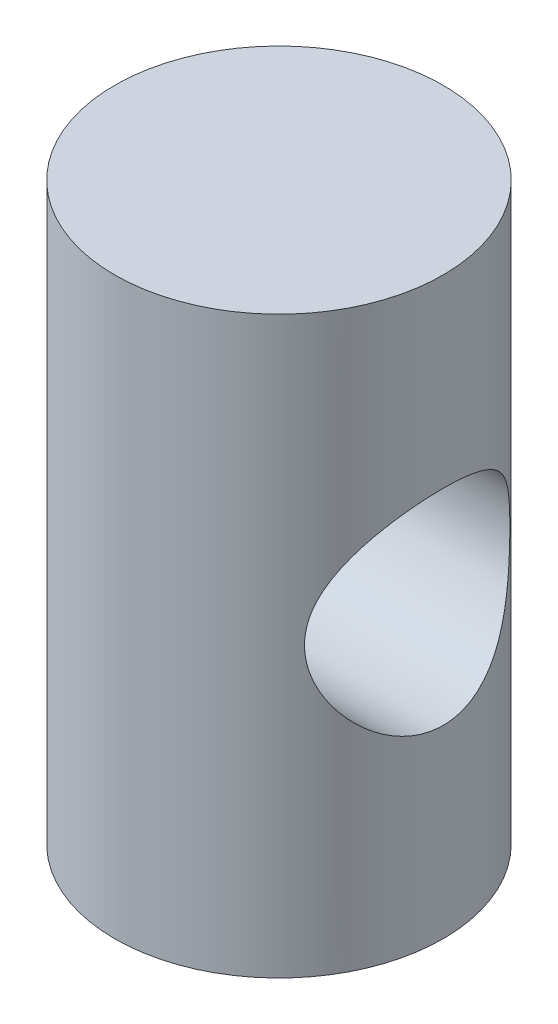
ISO-10303-21;
HEADER;
FILE_DESCRIPTION(('STEP AP214'),'2;1');
FILE_NAME('part.step','',(''),(''),'','','');
FILE_SCHEMA(('AUTOMOTIVE_DESIGN { 1 0 10303 214 1 1 1 1 }'));
ENDSEC;
DATA;
#1=APPLICATION_CONTEXT('core data for automotive mechanical design processes');
#2=APPLICATION_PROTOCOL_DEFINITION('international standard','automotive_design',2000,#1);
#3=PRODUCT_CONTEXT('',#1,'mechanical');
#4=PRODUCT('Part','Part','',(#3));
#5=PRODUCT_RELATED_PRODUCT_CATEGORY('part','',(#4));
#6=PRODUCT_DEFINITION_FORMATION('','',#4);
#7=PRODUCT_DEFINITION_CONTEXT('part definition',#1,'design');
#8=PRODUCT_DEFINITION('design','',#6,#7);
#9=PRODUCT_DEFINITION_SHAPE('','',#8);
#10=(LENGTH_UNIT() NAMED_UNIT(*) SI_UNIT(.MILLI.,.METRE.));
#11=(NAMED_UNIT(*) PLANE_ANGLE_UNIT() SI_UNIT($,.RADIAN.));
#12=(NAMED_UNIT(*) SI_UNIT($,.STERADIAN.) SOLID_ANGLE_UNIT());
#13=UNCERTAINTY_MEASURE_WITH_UNIT(LENGTH_MEASURE(1.E-05),#10,'distance_accuracy_value','');
#14=(GEOMETRIC_REPRESENTATION_CONTEXT(3) GLOBAL_UNCERTAINTY_ASSIGNED_CONTEXT((#13)) GLOBAL_UNIT_ASSIGNED_CONTEXT((#10,
#11,#12)) REPRESENTATION_CONTEXT('',''));
#15=CARTESIAN_POINT('',(0.,0.,0.));
#16=DIRECTION('',(0.,0.,1.));
#17=DIRECTION('',(1.,0.,0.));
#18=AXIS2_PLACEMENT_3D('',#15,#16,#17);
#19=CARTESIAN_POINT('',(0.,7.,0.));
#20=DIRECTION('',(0.,-1.,0.));
#21=DIRECTION('',(0.,0.,-1.));
#22=AXIS2_PLACEMENT_3D('',#19,#20,#21);
#23=CYLINDRICAL_SURFACE('',#22,4.);
#24=CARTESIAN_POINT('',(-3.1224989991992,0.,-2.5));
#25=CARTESIAN_POINT('',(-3.12249991555421,0.0621567514455108,-2.49999941097139));
#26=CARTESIAN_POINT('',(-3.12436490733917,0.124325946670792,-2.49767581942173));
#27=CARTESIAN_POINT('',(-3.13172923119026,0.248117179547742,-2.48843349840857));
#28=CARTESIAN_POINT('',(-3.13723070381364,0.309738873257102,-2.48151206248433));
#29=CARTESIAN_POINT('',(-3.15888953558505,0.493226047743712,-2.45397595058365));
#30=CARTESIAN_POINT('',(-3.18020036271142,0.613548331188979,-2.42658990946459));
#31=CARTESIAN_POINT('',(-3.23299770760367,0.845598197878236,-2.35576217141198));
#32=CARTESIAN_POINT('',(-3.26439575383209,0.957390415055104,-2.31245961359202));
#33=CARTESIAN_POINT('',(-3.3336600088444,1.17200852533406,-2.21143916430899));
#34=CARTESIAN_POINT('',(-3.37152639405534,1.27483417375309,-2.15372087963017));
#35=CARTESIAN_POINT('',(-3.45559225121876,1.48373398130366,-2.01647682425577));
#36=CARTESIAN_POINT('',(-3.50222814511578,1.58839332500452,-1.93506425666949));
#37=CARTESIAN_POINT('',(-3.59505503533368,1.7837615516238,-1.75662526657432));
#38=CARTESIAN_POINT('',(-3.64124561158438,1.87445827995362,-1.65958538899782));
#39=CARTESIAN_POINT('',(-3.73459524771314,2.05022029817268,-1.43833990582854));
#40=CARTESIAN_POINT('',(-3.78119887781505,2.13328618445043,-1.31226934259651));
#41=CARTESIAN_POINT('',(-3.84307251838774,2.24054515473624,-1.11163395543429));
#42=CARTESIAN_POINT('',(-3.86236283092052,2.27341513833311,-1.04281240974104));
#43=CARTESIAN_POINT('',(-3.89770436975436,2.33295468536328,-0.901758767615548));
#44=CARTESIAN_POINT('',(-3.91375783207118,2.35962853103842,-0.829529068393796));
#45=CARTESIAN_POINT('',(-3.94066759113823,2.40398381525628,-0.689700297916575));
#46=CARTESIAN_POINT('',(-3.95188535984466,2.42230197651811,-0.622371981278588));
#47=CARTESIAN_POINT('',(-3.97096241909162,2.45330228631336,-0.485997575898807));
#48=CARTESIAN_POINT('',(-3.97882364879721,2.46598768921621,-0.416952503441682));
#49=CARTESIAN_POINT('',(-3.99095470334737,2.48551379763454,-0.277765449857173));
#50=CARTESIAN_POINT('',(-3.99522674847834,2.49235811651341,-0.207624174243905));
#51=CARTESIAN_POINT('',(-4.00006125072438,2.50009921338922,-0.0669114466599384));
#52=CARTESIAN_POINT('',(-4.00062413482248,2.50099667596335,0.0036599548602794));
#53=CARTESIAN_POINT('',(-3.99704479619503,2.49527462645275,0.196045081555539));
#54=CARTESIAN_POINT('',(-3.98917040897436,2.48269349692112,0.317681845488536));
#55=CARTESIAN_POINT('',(-3.96290903275931,2.44026978203388,0.556636494620256));
#56=CARTESIAN_POINT('',(-3.94452124920477,2.41042589202638,0.673954052677426));
#57=CARTESIAN_POINT('',(-3.89876170711609,2.33479144071674,0.901771991763867));
#58=CARTESIAN_POINT('',(-3.87136697381047,2.28896008042893,1.01225407159606));
#59=CARTESIAN_POINT('',(-3.80971291751354,2.18306276101571,1.22404012071223));
#60=CARTESIAN_POINT('',(-3.77545203089318,2.12299355893635,1.32534199174245));
#61=CARTESIAN_POINT('',(-3.69786441247167,1.98194358307633,1.52942649744659));
#62=CARTESIAN_POINT('',(-3.65394006381521,1.89929072330952,1.63082454612907));
#63=CARTESIAN_POINT('',(-3.56390927740507,1.71973526279293,1.81919733573063));
#64=CARTESIAN_POINT('',(-3.51779973570409,1.62281195361603,1.90615071842624));
#65=CARTESIAN_POINT('',(-3.42142883464466,1.40258874682652,2.07470887167909));
#66=CARTESIAN_POINT('',(-3.37141162686597,1.27749723664192,2.15413229677844));
#67=CARTESIAN_POINT('',(-3.28028278192382,1.01270776269859,2.29052307550563));
#68=CARTESIAN_POINT('',(-3.23915480386931,0.873037312546894,2.34753179448504));
#69=CARTESIAN_POINT('',(-3.18183753131763,0.620461193893754,2.42437133527931));
#70=CARTESIAN_POINT('',(-3.16193408602513,0.510178074786512,2.45003683445404));
#71=CARTESIAN_POINT('',(-3.13358277759547,0.285769622440112,2.48620337073091));
#72=CARTESIAN_POINT('',(-3.12511926504439,0.171649757343194,2.49672512520811));
#73=CARTESIAN_POINT('',(-3.12092267030677,-0.0574573605024475,2.5019707209518));
#74=CARTESIAN_POINT('',(-3.12521876170185,-0.172446000478454,2.49665835896695));
#75=CARTESIAN_POINT('',(-3.14592085836188,-0.399561164318478,2.47051466367814));
#76=CARTESIAN_POINT('',(-3.16233689222906,-0.511685238371181,2.44967047849126));
#77=CARTESIAN_POINT('',(-3.20460120797143,-0.728436759425692,2.39409874195038));
#78=CARTESIAN_POINT('',(-3.23028954367817,-0.833157315894326,2.35960571424757));
#79=CARTESIAN_POINT('',(-3.28831148388749,-1.03557469989379,2.27804893702243));
#80=CARTESIAN_POINT('',(-3.32064744602081,-1.13326901887797,2.23098072583746));
#81=CARTESIAN_POINT('',(-3.39574401285203,-1.33861194166319,2.11530798730694));
#82=CARTESIAN_POINT('',(-3.43931724293015,-1.44461452730177,2.04430931160544));
#83=CARTESIAN_POINT('',(-3.52787943213338,-1.64437066065426,1.88737868921489));
#84=CARTESIAN_POINT('',(-3.57286982004467,-1.73811132124234,1.80143124902619));
#85=CARTESIAN_POINT('',(-3.66766209459505,-1.92596407064096,1.6007693249212));
#86=CARTESIAN_POINT('',(-3.71707933883201,-2.01772739848491,1.48365201617176));
#87=CARTESIAN_POINT('',(-3.80768973398606,-2.18014701471972,1.23256787407809));
#88=CARTESIAN_POINT('',(-3.84888673619009,-2.25081319512692,1.09860897940973));
#89=CARTESIAN_POINT('',(-3.89988966499776,-2.33658106797499,0.891930804655077));
#90=CARTESIAN_POINT('',(-3.91477055097245,-2.36129744395128,0.824318196039416));
#91=CARTESIAN_POINT('',(-3.94124643918619,-2.40493827673228,0.686640792876419));
#92=CARTESIAN_POINT('',(-3.95284334314805,-2.42386608615092,0.616577444051131));
#93=CARTESIAN_POINT('',(-3.9723851203995,-2.45560583013925,0.47463923146426));
#94=CARTESIAN_POINT('',(-3.98033317908836,-2.46842309951643,0.402766005755503));
#95=CARTESIAN_POINT('',(-3.99234168343343,-2.48773917229289,0.257881807142457));
#96=CARTESIAN_POINT('',(-3.99640277220024,-2.49423902093079,0.184871024482531));
#97=CARTESIAN_POINT('',(-4.00191521492706,-2.50307151550711,-0.0131102774248963));
#98=CARTESIAN_POINT('',(-3.99952706123947,-2.49926579290941,-0.138539079205454));
#99=CARTESIAN_POINT('',(-3.98321975018363,-2.47308241045447,-0.386583137102135));
#100=CARTESIAN_POINT('',(-3.96930111604857,-2.45070559332119,-0.509198520626834));
#101=CARTESIAN_POINT('',(-3.93192083384285,-2.38967758445389,-0.744080605483852));
#102=CARTESIAN_POINT('',(-3.90880701054803,-2.35161792643533,-0.856558752631814));
#103=CARTESIAN_POINT('',(-3.85489971248843,-2.26088053755652,-1.07343034721918));
#104=CARTESIAN_POINT('',(-3.82410494215309,-2.2082003404328,-1.17782242685803));
#105=CARTESIAN_POINT('',(-3.75350673935648,-2.08367872128004,-1.38731297754797));
#106=CARTESIAN_POINT('',(-3.71310001864657,-2.0104160092425,-1.4913601218378));
#107=CARTESIAN_POINT('',(-3.62867283985206,-1.84984676748589,-1.68643334934803));
#108=CARTESIAN_POINT('',(-3.58464833191203,-1.76252439116572,-1.77744451843681));
#109=CARTESIAN_POINT('',(-3.49000828219719,-1.56176748493813,-1.95744716561589));
#110=CARTESIAN_POINT('',(-3.43935738427104,-1.44638338742857,-2.04425661250064));
#111=CARTESIAN_POINT('',(-3.34349647457112,-1.20071059024024,-2.19754648509904));
#112=CARTESIAN_POINT('',(-3.2982834620419,-1.07043018884747,-2.26403815415028));
#113=CARTESIAN_POINT('',(-3.22859539780091,-0.827194699215084,-2.3619822941284));
#114=CARTESIAN_POINT('',(-3.20174639338769,-0.716729427846442,-2.39792458576829));
#115=CARTESIAN_POINT('',(-3.1587835810451,-0.490060656998224,-2.45425618419746));
#116=CARTESIAN_POINT('',(-3.14263581150428,-0.373876580200281,-2.47469472410168));
#117=CARTESIAN_POINT('',(-3.12952857640607,-0.213940005353927,-2.49119847139522));
#118=CARTESIAN_POINT('',(-3.1268999430677,-0.171274474291342,-2.49449433837959));
#119=CARTESIAN_POINT('',(-3.12338461939862,-0.0857413010482517,-2.49889558125807));
#120=CARTESIAN_POINT('',(-3.12249836712871,-0.0428736107566455,-2.50000040629188));
#121=CARTESIAN_POINT('',(-3.1224989991992,0.,-2.5));
#122=B_SPLINE_CURVE_WITH_KNOTS('',3,(#24,#25,#26,#27,#28,#29,#30,#31,#32,#33,#34,#35,#36,#37,
#38,#39,#40,#41,#42,#43,#44,#45,#46,#47,#48,#49,#50,#51,#52,#53,#54,#55,#56,#57,#58,#59,#60,#61,
#62,#63,#64,#65,#66,#67,#68,#69,#70,#71,#72,#73,#74,#75,#76,#77,#78,#79,#80,#81,#82,#83,#84,#85,
#86,#87,#88,#89,#90,#91,#92,#93,#94,#95,#96,#97,#98,#99,#100,#101,#102,#103,#104,#105,#106,#107,
#108,#109,#110,#111,#112,#113,#114,#115,#116,#117,#118,#119,#120,#121),.UNSPECIFIED.,.T.,.F.,(4,
2,2,2,2,2,2,2,2,2,2,2,2,2,2,2,2,2,2,2,2,2,2,2,2,2,2,2,2,2,2,2,2,2,2,2,2,2,2,2,2,2,2,2,2,2,2,2,
4),(0.,0.18641531585846,0.372940459994496,0.746478880764687,1.11682668423133,1.48718459072605,
1.90722798685071,2.32763499192879,2.7987602926597,3.03445880867314,3.26999394209509,
3.48170145743206,3.69328649746504,3.90474055342595,4.11617026725867,4.48184709708114,
4.84755156693919,5.21419620193004,5.58092442797435,5.99329080205307,6.40626158573465,
6.87316206383505,7.33919680735486,7.68265621505466,8.02564530559509,8.36941921026407,
8.7134778886509,9.05186495232126,9.390372235192,9.79332737765188,10.1967026751544,
10.6647326786671,11.1325428866818,11.3527929661039,11.5729152387447,11.7928449800804,
12.0127383271002,12.3871595324234,12.7615637480926,13.1229788842094,13.4844550226785,
13.8834503840958,14.2828986410983,14.7399238503459,15.1966956936287,15.5530255473292,
15.9082190611886,16.0367696833384,16.1653526209168),.UNSPECIFIED.);
#123=CARTESIAN_POINT('',(-3.1224989991992,0.,-2.5));
#124=VERTEX_POINT('',#123);
#125=EDGE_CURVE('E47',#124,#124,#122,.T.);
#126=ORIENTED_EDGE('',*,*,#125,.T.);
#127=EDGE_LOOP('',(#126));
#128=FACE_BOUND('',#127,.T.);
#129=CARTESIAN_POINT('',(3.1224989991992,0.,-2.5));
#130=CARTESIAN_POINT('',(3.12249991555421,-0.0621567514455108,-2.49999941097139));
#131=CARTESIAN_POINT('',(3.12436490733917,-0.124325946670792,-2.49767581942173));
#132=CARTESIAN_POINT('',(3.13172923119026,-0.248117179547742,-2.48843349840857));
#133=CARTESIAN_POINT('',(3.13723070381364,-0.309738873257102,-2.48151206248433));
#134=CARTESIAN_POINT('',(3.15888953558505,-0.493226047743712,-2.45397595058365));
#135=CARTESIAN_POINT('',(3.18020036271142,-0.613548331188979,-2.42658990946459));
#136=CARTESIAN_POINT('',(3.23299770760367,-0.845598197878236,-2.35576217141198));
#137=CARTESIAN_POINT('',(3.26439575383209,-0.957390415055104,-2.31245961359202));
#138=CARTESIAN_POINT('',(3.3336600088444,-1.17200852533406,-2.21143916430899));
#139=CARTESIAN_POINT('',(3.37152639405534,-1.27483417375309,-2.15372087963017));
#140=CARTESIAN_POINT('',(3.45559225121876,-1.48373398130366,-2.01647682425577));
#141=CARTESIAN_POINT('',(3.50222814511578,-1.58839332500452,-1.93506425666949));
#142=CARTESIAN_POINT('',(3.59505503533368,-1.7837615516238,-1.75662526657432));
#143=CARTESIAN_POINT('',(3.64124561158438,-1.87445827995362,-1.65958538899782));
#144=CARTESIAN_POINT('',(3.73459524771314,-2.05022029817268,-1.43833990582854));
#145=CARTESIAN_POINT('',(3.78119887781505,-2.13328618445043,-1.31226934259651));
#146=CARTESIAN_POINT('',(3.84307251838774,-2.24054515473624,-1.11163395543429));
#147=CARTESIAN_POINT('',(3.86236283092052,-2.27341513833311,-1.04281240974104));
#148=CARTESIAN_POINT('',(3.89770436975436,-2.33295468536328,-0.901758767615548));
#149=CARTESIAN_POINT('',(3.91375783207118,-2.35962853103842,-0.829529068393796));
#150=CARTESIAN_POINT('',(3.94066759113823,-2.40398381525628,-0.689700297916575));
#151=CARTESIAN_POINT('',(3.95188535984466,-2.42230197651811,-0.622371981278588));
#152=CARTESIAN_POINT('',(3.97096241909162,-2.45330228631336,-0.485997575898807));
#153=CARTESIAN_POINT('',(3.97882364879721,-2.46598768921621,-0.416952503441682));
#154=CARTESIAN_POINT('',(3.99095470334737,-2.48551379763454,-0.277765449857173));
#155=CARTESIAN_POINT('',(3.99522674847834,-2.49235811651341,-0.207624174243905));
#156=CARTESIAN_POINT('',(4.00006125072438,-2.50009921338922,-0.0669114466599384));
#157=CARTESIAN_POINT('',(4.00062413482248,-2.50099667596335,0.0036599548602794));
#158=CARTESIAN_POINT('',(3.99704479619503,-2.49527462645275,0.196045081555539));
#159=CARTESIAN_POINT('',(3.98917040897436,-2.48269349692112,0.317681845488536));
#160=CARTESIAN_POINT('',(3.96290903275931,-2.44026978203388,0.556636494620256));
#161=CARTESIAN_POINT('',(3.94452124920477,-2.41042589202638,0.673954052677426));
#162=CARTESIAN_POINT('',(3.89876170711609,-2.33479144071674,0.901771991763867));
#163=CARTESIAN_POINT('',(3.87136697381047,-2.28896008042893,1.01225407159606));
#164=CARTESIAN_POINT('',(3.80971291751354,-2.18306276101571,1.22404012071223));
#165=CARTESIAN_POINT('',(3.77545203089318,-2.12299355893635,1.32534199174245));
#166=CARTESIAN_POINT('',(3.69786441247167,-1.98194358307633,1.52942649744659));
#167=CARTESIAN_POINT('',(3.65394006381521,-1.89929072330952,1.63082454612907));
#168=CARTESIAN_POINT('',(3.56390927740507,-1.71973526279293,1.81919733573063));
#169=CARTESIAN_POINT('',(3.51779973570409,-1.62281195361603,1.90615071842624));
#170=CARTESIAN_POINT('',(3.42142883464466,-1.40258874682652,2.07470887167909));
#171=CARTESIAN_POINT('',(3.37141162686597,-1.27749723664192,2.15413229677844));
#172=CARTESIAN_POINT('',(3.28028278192382,-1.01270776269859,2.29052307550563));
#173=CARTESIAN_POINT('',(3.23915480386931,-0.873037312546894,2.34753179448504));
#174=CARTESIAN_POINT('',(3.18183753131763,-0.620461193893754,2.42437133527931));
#175=CARTESIAN_POINT('',(3.16193408602513,-0.510178074786512,2.45003683445404));
#176=CARTESIAN_POINT('',(3.13358277759547,-0.285769622440112,2.48620337073091));
#177=CARTESIAN_POINT('',(3.12511926504439,-0.171649757343194,2.49672512520811));
#178=CARTESIAN_POINT('',(3.12092267030677,0.0574573605024475,2.5019707209518));
#179=CARTESIAN_POINT('',(3.12521876170185,0.172446000478454,2.49665835896695));
#180=CARTESIAN_POINT('',(3.14592085836188,0.399561164318478,2.47051466367814));
#181=CARTESIAN_POINT('',(3.16233689222906,0.511685238371181,2.44967047849126));
#182=CARTESIAN_POINT('',(3.20460120797143,0.728436759425692,2.39409874195038));
#183=CARTESIAN_POINT('',(3.23028954367817,0.833157315894326,2.35960571424757));
#184=CARTESIAN_POINT('',(3.28831148388749,1.03557469989379,2.27804893702243));
#185=CARTESIAN_POINT('',(3.32064744602081,1.13326901887797,2.23098072583746));
#186=CARTESIAN_POINT('',(3.39574401285203,1.33861194166319,2.11530798730694));
#187=CARTESIAN_POINT('',(3.43931724293015,1.44461452730177,2.04430931160544));
#188=CARTESIAN_POINT('',(3.52787943213338,1.64437066065426,1.88737868921489));
#189=CARTESIAN_POINT('',(3.57286982004467,1.73811132124234,1.80143124902619));
#190=CARTESIAN_POINT('',(3.66766209459505,1.92596407064096,1.6007693249212));
#191=CARTESIAN_POINT('',(3.71707933883201,2.01772739848491,1.48365201617176));
#192=CARTESIAN_POINT('',(3.80768973398606,2.18014701471972,1.23256787407809));
#193=CARTESIAN_POINT('',(3.84888673619009,2.25081319512692,1.09860897940973));
#194=CARTESIAN_POINT('',(3.89988966499776,2.33658106797499,0.891930804655077));
#195=CARTESIAN_POINT('',(3.91477055097245,2.36129744395128,0.824318196039416));
#196=CARTESIAN_POINT('',(3.94124643918619,2.40493827673228,0.686640792876419));
#197=CARTESIAN_POINT('',(3.95284334314805,2.42386608615092,0.616577444051131));
#198=CARTESIAN_POINT('',(3.9723851203995,2.45560583013925,0.47463923146426));
#199=CARTESIAN_POINT('',(3.98033317908836,2.46842309951643,0.402766005755503));
#200=CARTESIAN_POINT('',(3.99234168343343,2.48773917229289,0.257881807142457));
#201=CARTESIAN_POINT('',(3.99640277220024,2.49423902093079,0.184871024482531));
#202=CARTESIAN_POINT('',(4.00191521492706,2.50307151550711,-0.0131102774248963));
#203=CARTESIAN_POINT('',(3.99952706123947,2.49926579290941,-0.138539079205454));
#204=CARTESIAN_POINT('',(3.98321975018363,2.47308241045447,-0.386583137102135));
#205=CARTESIAN_POINT('',(3.96930111604857,2.45070559332119,-0.509198520626834));
#206=CARTESIAN_POINT('',(3.93192083384285,2.38967758445389,-0.744080605483852));
#207=CARTESIAN_POINT('',(3.90880701054803,2.35161792643533,-0.856558752631814));
#208=CARTESIAN_POINT('',(3.85489971248843,2.26088053755652,-1.07343034721918));
#209=CARTESIAN_POINT('',(3.82410494215309,2.2082003404328,-1.17782242685803));
#210=CARTESIAN_POINT('',(3.75350673935648,2.08367872128004,-1.38731297754797));
#211=CARTESIAN_POINT('',(3.71310001864657,2.0104160092425,-1.4913601218378));
#212=CARTESIAN_POINT('',(3.62867283985206,1.84984676748589,-1.68643334934803));
#213=CARTESIAN_POINT('',(3.58464833191203,1.76252439116572,-1.77744451843681));
#214=CARTESIAN_POINT('',(3.49000828219719,1.56176748493813,-1.95744716561589));
#215=CARTESIAN_POINT('',(3.43935738427104,1.44638338742857,-2.04425661250064));
#216=CARTESIAN_POINT('',(3.34349647457112,1.20071059024024,-2.19754648509904));
#217=CARTESIAN_POINT('',(3.2982834620419,1.07043018884747,-2.26403815415028));
#218=CARTESIAN_POINT('',(3.22859539780091,0.827194699215084,-2.3619822941284));
#219=CARTESIAN_POINT('',(3.20174639338769,0.716729427846442,-2.39792458576829));
#220=CARTESIAN_POINT('',(3.1587835810451,0.490060656998224,-2.45425618419746));
#221=CARTESIAN_POINT('',(3.14263581150428,0.373876580200281,-2.47469472410168));
#222=CARTESIAN_POINT('',(3.12952857640607,0.213940005353927,-2.49119847139522));
#223=CARTESIAN_POINT('',(3.1268999430677,0.171274474291342,-2.49449433837959));
#224=CARTESIAN_POINT('',(3.12338461939862,0.0857413010482517,-2.49889558125807));
#225=CARTESIAN_POINT('',(3.12249836712871,0.0428736107566455,-2.50000040629188));
#226=CARTESIAN_POINT('',(3.1224989991992,0.,-2.5));
#227=B_SPLINE_CURVE_WITH_KNOTS('',3,(#129,#130,#131,#132,#133,#134,#135,#136,#137,#138,#139,
#140,#141,#142,#143,#144,#145,#146,#147,#148,#149,#150,#151,#152,#153,#154,#155,#156,#157,#158,
#159,#160,#161,#162,#163,#164,#165,#166,#167,#168,#169,#170,#171,#172,#173,#174,#175,#176,#177,
#178,#179,#180,#181,#182,#183,#184,#185,#186,#187,#188,#189,#190,#191,#192,#193,#194,#195,#196,
#197,#198,#199,#200,#201,#202,#203,#204,#205,#206,#207,#208,#209,#210,#211,#212,#213,#214,#215,
#216,#217,#218,#219,#220,#221,#222,#223,#224,#225,#226),.UNSPECIFIED.,.T.,.F.,(4,2,2,2,2,2,2,2,
2,2,2,2,2,2,2,2,2,2,2,2,2,2,2,2,2,2,2,2,2,2,2,2,2,2,2,2,2,2,2,2,2,2,2,2,2,2,2,2,4),(0.,
0.18641531585846,0.372940459994496,0.746478880764687,1.11682668423133,1.48718459072605,
1.90722798685071,2.32763499192879,2.7987602926597,3.03445880867314,3.26999394209509,
3.48170145743206,3.69328649746504,3.90474055342595,4.11617026725867,4.48184709708114,
4.84755156693919,5.21419620193004,5.58092442797435,5.99329080205307,6.40626158573465,
6.87316206383505,7.33919680735486,7.68265621505466,8.02564530559509,8.36941921026407,
8.7134778886509,9.05186495232126,9.390372235192,9.79332737765188,10.1967026751544,
10.6647326786671,11.1325428866818,11.3527929661039,11.5729152387447,11.7928449800804,
12.0127383271002,12.3871595324234,12.7615637480926,13.1229788842094,13.4844550226785,
13.8834503840958,14.2828986410983,14.7399238503459,15.1966956936287,15.5530255473292,
15.9082190611886,16.0367696833384,16.1653526209168),.UNSPECIFIED.);
#228=CARTESIAN_POINT('',(3.1224989991992,0.,-2.5));
#229=VERTEX_POINT('',#228);
#230=EDGE_CURVE('E63',#229,#229,#227,.T.);
#231=ORIENTED_EDGE('',*,*,#230,.T.);
#232=EDGE_LOOP('',(#231));
#233=FACE_BOUND('',#232,.T.);
#234=CARTESIAN_POINT('',(0.,7.,0.));
#235=DIRECTION('',(0.,1.,0.));
#236=DIRECTION('',(0.,0.,1.));
#237=AXIS2_PLACEMENT_3D('',#234,#235,#236);
#238=CIRCLE('',#237,4.);
#239=CARTESIAN_POINT('',(0.,7.,4.));
#240=VERTEX_POINT('',#239);
#241=EDGE_CURVE('E10',#240,#240,#238,.T.);
#242=ORIENTED_EDGE('',*,*,#241,.F.);
#243=EDGE_LOOP('',(#242));
#244=FACE_BOUND('',#243,.T.);
#245=CARTESIAN_POINT('',(0.,-7.,0.));
#246=DIRECTION('',(0.,1.,0.));
#247=DIRECTION('',(0.,0.,1.));
#248=AXIS2_PLACEMENT_3D('',#245,#246,#247);
#249=CIRCLE('',#248,4.);
#250=CARTESIAN_POINT('',(0.,-7.,4.));
#251=VERTEX_POINT('',#250);
#252=EDGE_CURVE('E56',#251,#251,#249,.T.);
#253=ORIENTED_EDGE('',*,*,#252,.T.);
#254=EDGE_LOOP('',(#253));
#255=FACE_BOUND('',#254,.T.);
#256=ADVANCED_FACE('F43',(#128,#233,#244,#255),#23,.T.);
#257=CARTESIAN_POINT('',(0.,7.,0.));
#258=DIRECTION('',(0.,1.,0.));
#259=DIRECTION('',(0.,0.,1.));
#260=AXIS2_PLACEMENT_3D('',#257,#258,#259);
#261=PLANE('',#260);
#262=ORIENTED_EDGE('',*,*,#241,.T.);
#263=EDGE_LOOP('',(#262));
#264=FACE_BOUND('',#263,.T.);
#265=ADVANCED_FACE('F75',(#264),#261,.T.);
#266=CARTESIAN_POINT('',(0.,-7.,0.));
#267=DIRECTION('',(0.,1.,0.));
#268=DIRECTION('',(0.,0.,1.));
#269=AXIS2_PLACEMENT_3D('',#266,#267,#268);
#270=PLANE('',#269);
#271=ORIENTED_EDGE('',*,*,#252,.F.);
#272=EDGE_LOOP('',(#271));
#273=FACE_BOUND('',#272,.T.);
#274=ADVANCED_FACE('F73',(#273),#270,.F.);
#275=CARTESIAN_POINT('',(-7.,0.,0.));
#276=DIRECTION('',(1.,0.,0.));
#277=DIRECTION('',(0.,0.,-1.));
#278=AXIS2_PLACEMENT_3D('',#275,#276,#277);
#279=CYLINDRICAL_SURFACE('',#278,2.5);
#280=ORIENTED_EDGE('',*,*,#230,.F.);
#281=EDGE_LOOP('',(#280));
#282=FACE_BOUND('',#281,.T.);
#283=ORIENTED_EDGE('',*,*,#125,.F.);
#284=EDGE_LOOP('',(#283));
#285=FACE_BOUND('',#284,.T.);
#286=ADVANCED_FACE('F69',(#282,#285),#279,.F.);
#287=CLOSED_SHELL('',(#256,#265,#274,#286));
#288=MANIFOLD_SOLID_BREP('B2',#287);
#289=ADVANCED_BREP_SHAPE_REPRESENTATION('',(#18,#288),#14);
#290=SHAPE_DEFINITION_REPRESENTATION(#9,#289);
ENDSEC;
END-ISO-10303-21;
